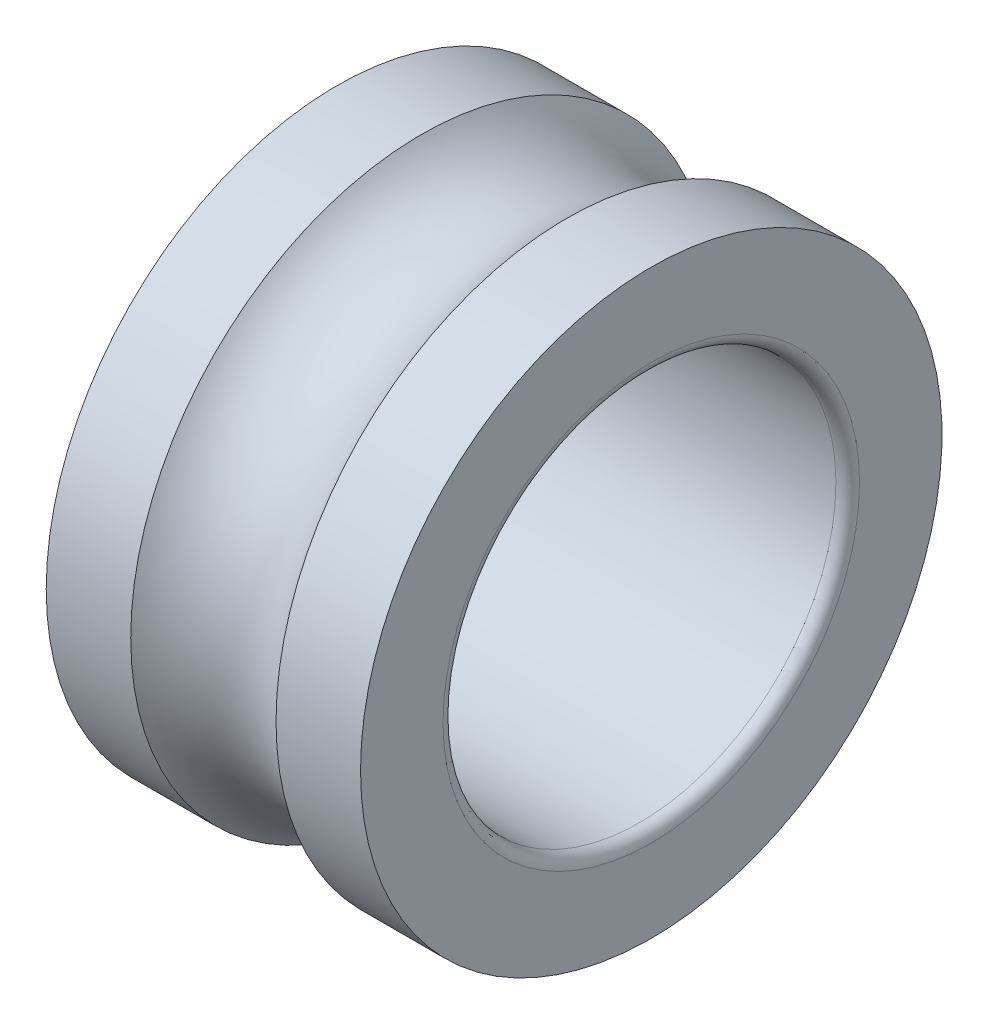
ISO-10303-21;
HEADER;
FILE_DESCRIPTION(('STEP AP214'),'2;1');
FILE_NAME('part.step','',(''),(''),'','','');
FILE_SCHEMA(('AUTOMOTIVE_DESIGN { 1 0 10303 214 1 1 1 1 }'));
ENDSEC;
DATA;
#1=APPLICATION_CONTEXT('core data for automotive mechanical design processes');
#2=APPLICATION_PROTOCOL_DEFINITION('international standard','automotive_design',2000,#1);
#3=PRODUCT_CONTEXT('',#1,'mechanical');
#4=PRODUCT('Part','Part','',(#3));
#5=PRODUCT_RELATED_PRODUCT_CATEGORY('part','',(#4));
#6=PRODUCT_DEFINITION_FORMATION('','',#4);
#7=PRODUCT_DEFINITION_CONTEXT('part definition',#1,'design');
#8=PRODUCT_DEFINITION('design','',#6,#7);
#9=PRODUCT_DEFINITION_SHAPE('','',#8);
#10=(LENGTH_UNIT() NAMED_UNIT(*) SI_UNIT(.MILLI.,.METRE.));
#11=(NAMED_UNIT(*) PLANE_ANGLE_UNIT() SI_UNIT($,.RADIAN.));
#12=(NAMED_UNIT(*) SI_UNIT($,.STERADIAN.) SOLID_ANGLE_UNIT());
#13=UNCERTAINTY_MEASURE_WITH_UNIT(LENGTH_MEASURE(1.E-05),#10,'distance_accuracy_value','');
#14=(GEOMETRIC_REPRESENTATION_CONTEXT(3) GLOBAL_UNCERTAINTY_ASSIGNED_CONTEXT((#13)) GLOBAL_UNIT_ASSIGNED_CONTEXT((#10,
#11,#12)) REPRESENTATION_CONTEXT('',''));
#15=CARTESIAN_POINT('',(0.,0.,0.));
#16=DIRECTION('',(0.,0.,1.));
#17=DIRECTION('',(1.,0.,0.));
#18=AXIS2_PLACEMENT_3D('',#15,#16,#17);
#19=CARTESIAN_POINT('',(0.29999999999994,0.,0.));
#20=DIRECTION('',(-1.,0.,0.));
#21=DIRECTION('',(0.,0.,1.));
#22=AXIS2_PLACEMENT_3D('',#19,#20,#21);
#23=TOROIDAL_SURFACE('',#22,5.29999999999994,0.29999999999994);
#24=CARTESIAN_POINT('',(0.300000000000002,0.,0.));
#25=DIRECTION('',(-1.,0.,0.));
#26=DIRECTION('',(0.,0.,1.));
#27=AXIS2_PLACEMENT_3D('',#24,#25,#26);
#28=CIRCLE('',#27,5.);
#29=CARTESIAN_POINT('',(0.300000000000002,0.,5.));
#30=VERTEX_POINT('',#29);
#31=EDGE_CURVE('E10',#30,#30,#28,.T.);
#32=ORIENTED_EDGE('',*,*,#31,.F.);
#33=EDGE_LOOP('',(#32));
#34=FACE_BOUND('',#33,.T.);
#35=CARTESIAN_POINT('',(0.,0.,0.));
#36=DIRECTION('',(-1.,0.,0.));
#37=DIRECTION('',(0.,0.,1.));
#38=AXIS2_PLACEMENT_3D('',#35,#36,#37);
#39=CIRCLE('',#38,5.3);
#40=CARTESIAN_POINT('',(0.,0.,5.3));
#41=VERTEX_POINT('',#40);
#42=EDGE_CURVE('E59',#41,#41,#39,.T.);
#43=ORIENTED_EDGE('',*,*,#42,.T.);
#44=EDGE_LOOP('',(#43));
#45=FACE_BOUND('',#44,.T.);
#46=ADVANCED_FACE('F31',(#34,#45),#23,.T.);
#47=CARTESIAN_POINT('',(50.,0.,0.));
#48=DIRECTION('',(-1.,0.,0.));
#49=DIRECTION('',(0.,0.,1.));
#50=AXIS2_PLACEMENT_3D('',#47,#48,#49);
#51=CYLINDRICAL_SURFACE('',#50,5.);
#52=CARTESIAN_POINT('',(7.7,0.,0.));
#53=DIRECTION('',(-1.,0.,0.));
#54=DIRECTION('',(0.,0.,1.));
#55=AXIS2_PLACEMENT_3D('',#52,#53,#54);
#56=CIRCLE('',#55,5.);
#57=CARTESIAN_POINT('',(7.7,0.,5.));
#58=VERTEX_POINT('',#57);
#59=EDGE_CURVE('E37',#58,#58,#56,.T.);
#60=ORIENTED_EDGE('',*,*,#59,.F.);
#61=EDGE_LOOP('',(#60));
#62=FACE_BOUND('',#61,.T.);
#63=ORIENTED_EDGE('',*,*,#31,.T.);
#64=EDGE_LOOP('',(#63));
#65=FACE_BOUND('',#64,.T.);
#66=ADVANCED_FACE('F96',(#62,#65),#51,.F.);
#67=CARTESIAN_POINT('',(7.70000000000012,0.,0.));
#68=DIRECTION('',(-1.,0.,0.));
#69=DIRECTION('',(0.,0.,1.));
#70=AXIS2_PLACEMENT_3D('',#67,#68,#69);
#71=TOROIDAL_SURFACE('',#70,5.29999999999988,0.299999999999879);
#72=CARTESIAN_POINT('',(8.,0.,0.));
#73=DIRECTION('',(-1.,0.,0.));
#74=DIRECTION('',(0.,0.,1.));
#75=AXIS2_PLACEMENT_3D('',#72,#73,#74);
#76=CIRCLE('',#75,5.3);
#77=CARTESIAN_POINT('',(8.,0.,5.3));
#78=VERTEX_POINT('',#77);
#79=EDGE_CURVE('E41',#78,#78,#76,.T.);
#80=ORIENTED_EDGE('',*,*,#79,.F.);
#81=EDGE_LOOP('',(#80));
#82=FACE_BOUND('',#81,.T.);
#83=ORIENTED_EDGE('',*,*,#59,.T.);
#84=EDGE_LOOP('',(#83));
#85=FACE_BOUND('',#84,.T.);
#86=ADVANCED_FACE('F91',(#82,#85),#71,.T.);
#87=CARTESIAN_POINT('',(8.,5.3,0.));
#88=DIRECTION('',(-1.,0.,0.));
#89=DIRECTION('',(0.,0.,1.));
#90=AXIS2_PLACEMENT_3D('',#87,#88,#89);
#91=PLANE('',#90);
#92=CARTESIAN_POINT('',(8.,0.,0.));
#93=DIRECTION('',(-1.,0.,0.));
#94=DIRECTION('',(0.,0.,1.));
#95=AXIS2_PLACEMENT_3D('',#92,#93,#94);
#96=CIRCLE('',#95,7.4);
#97=CARTESIAN_POINT('',(8.,0.,7.4));
#98=VERTEX_POINT('',#97);
#99=EDGE_CURVE('E45',#98,#98,#96,.T.);
#100=ORIENTED_EDGE('',*,*,#99,.F.);
#101=EDGE_LOOP('',(#100));
#102=FACE_BOUND('',#101,.T.);
#103=ORIENTED_EDGE('',*,*,#79,.T.);
#104=EDGE_LOOP('',(#103));
#105=FACE_BOUND('',#104,.T.);
#106=ADVANCED_FACE('F85',(#102,#105),#91,.F.);
#107=CARTESIAN_POINT('',(50.,0.,0.));
#108=DIRECTION('',(-1.,0.,0.));
#109=DIRECTION('',(0.,0.,1.));
#110=AXIS2_PLACEMENT_3D('',#107,#108,#109);
#111=CYLINDRICAL_SURFACE('',#110,7.4);
#112=CARTESIAN_POINT('',(5.8490973473563,0.,0.));
#113=DIRECTION('',(-1.,0.,0.));
#114=DIRECTION('',(0.,0.,1.));
#115=AXIS2_PLACEMENT_3D('',#112,#113,#114);
#116=CIRCLE('',#115,7.4);
#117=CARTESIAN_POINT('',(5.8490973473563,0.,7.4));
#118=VERTEX_POINT('',#117);
#119=EDGE_CURVE('E50',#118,#118,#116,.T.);
#120=ORIENTED_EDGE('',*,*,#119,.F.);
#121=EDGE_LOOP('',(#120));
#122=FACE_BOUND('',#121,.T.);
#123=ORIENTED_EDGE('',*,*,#99,.T.);
#124=EDGE_LOOP('',(#123));
#125=FACE_BOUND('',#124,.T.);
#126=ADVANCED_FACE('F79',(#122,#125),#111,.T.);
#127=CARTESIAN_POINT('',(4.,0.,0.));
#128=DIRECTION('',(-1.,0.,0.));
#129=DIRECTION('',(0.,0.,1.));
#130=AXIS2_PLACEMENT_3D('',#127,#128,#129);
#131=TOROIDAL_SURFACE('',#130,8.90000000000006,2.38100000000006);
#132=CARTESIAN_POINT('',(2.1509026526437,0.,0.));
#133=DIRECTION('',(-1.,0.,0.));
#134=DIRECTION('',(0.,0.,1.));
#135=AXIS2_PLACEMENT_3D('',#132,#133,#134);
#136=CIRCLE('',#135,7.4);
#137=CARTESIAN_POINT('',(2.1509026526437,0.,7.4));
#138=VERTEX_POINT('',#137);
#139=EDGE_CURVE('E53',#138,#138,#136,.T.);
#140=ORIENTED_EDGE('',*,*,#139,.F.);
#141=EDGE_LOOP('',(#140));
#142=FACE_BOUND('',#141,.T.);
#143=ORIENTED_EDGE('',*,*,#119,.T.);
#144=EDGE_LOOP('',(#143));
#145=FACE_BOUND('',#144,.T.);
#146=ADVANCED_FACE('F73',(#142,#145),#131,.F.);
#147=CARTESIAN_POINT('',(50.,0.,0.));
#148=DIRECTION('',(-1.,0.,0.));
#149=DIRECTION('',(0.,0.,1.));
#150=AXIS2_PLACEMENT_3D('',#147,#148,#149);
#151=CYLINDRICAL_SURFACE('',#150,7.4);
#152=CARTESIAN_POINT('',(0.,0.,0.));
#153=DIRECTION('',(-1.,0.,0.));
#154=DIRECTION('',(0.,0.,1.));
#155=AXIS2_PLACEMENT_3D('',#152,#153,#154);
#156=CIRCLE('',#155,7.4);
#157=CARTESIAN_POINT('',(0.,0.,7.4));
#158=VERTEX_POINT('',#157);
#159=EDGE_CURVE('E56',#158,#158,#156,.T.);
#160=ORIENTED_EDGE('',*,*,#159,.F.);
#161=EDGE_LOOP('',(#160));
#162=FACE_BOUND('',#161,.T.);
#163=ORIENTED_EDGE('',*,*,#139,.T.);
#164=EDGE_LOOP('',(#163));
#165=FACE_BOUND('',#164,.T.);
#166=ADVANCED_FACE('F67',(#162,#165),#151,.T.);
#167=CARTESIAN_POINT('',(0.,7.4,0.));
#168=DIRECTION('',(1.,0.,0.));
#169=DIRECTION('',(0.,0.,-1.));
#170=AXIS2_PLACEMENT_3D('',#167,#168,#169);
#171=PLANE('',#170);
#172=ORIENTED_EDGE('',*,*,#42,.F.);
#173=EDGE_LOOP('',(#172));
#174=FACE_BOUND('',#173,.T.);
#175=ORIENTED_EDGE('',*,*,#159,.T.);
#176=EDGE_LOOP('',(#175));
#177=FACE_BOUND('',#176,.T.);
#178=ADVANCED_FACE('F64',(#174,#177),#171,.F.);
#179=CLOSED_SHELL('',(#46,#66,#86,#106,#126,#146,#166,#178));
#180=MANIFOLD_SOLID_BREP('B2',#179);
#181=ADVANCED_BREP_SHAPE_REPRESENTATION('',(#18,#180),#14);
#182=SHAPE_DEFINITION_REPRESENTATION(#9,#181);
ENDSEC;
END-ISO-10303-21;
